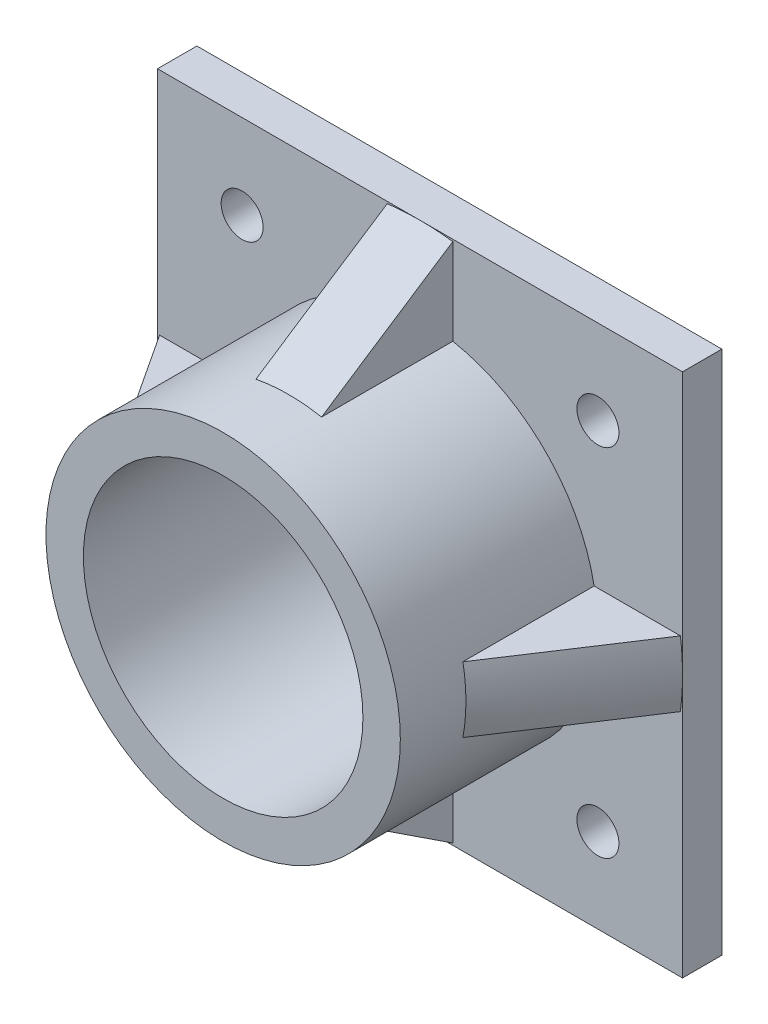
ISO-10303-21;
HEADER;
FILE_DESCRIPTION(('STEP AP214'),'2;1');
FILE_NAME('part.step','',(''),(''),'','','');
FILE_SCHEMA(('AUTOMOTIVE_DESIGN { 1 0 10303 214 1 1 1 1 }'));
ENDSEC;
DATA;
#1=APPLICATION_CONTEXT('core data for automotive mechanical design processes');
#2=APPLICATION_PROTOCOL_DEFINITION('international standard','automotive_design',2000,#1);
#3=PRODUCT_CONTEXT('',#1,'mechanical');
#4=PRODUCT('Part','Part','',(#3));
#5=PRODUCT_RELATED_PRODUCT_CATEGORY('part','',(#4));
#6=PRODUCT_DEFINITION_FORMATION('','',#4);
#7=PRODUCT_DEFINITION_CONTEXT('part definition',#1,'design');
#8=PRODUCT_DEFINITION('design','',#6,#7);
#9=PRODUCT_DEFINITION_SHAPE('','',#8);
#10=(LENGTH_UNIT() NAMED_UNIT(*) SI_UNIT(.MILLI.,.METRE.));
#11=(NAMED_UNIT(*) PLANE_ANGLE_UNIT() SI_UNIT($,.RADIAN.));
#12=(NAMED_UNIT(*) SI_UNIT($,.STERADIAN.) SOLID_ANGLE_UNIT());
#13=UNCERTAINTY_MEASURE_WITH_UNIT(LENGTH_MEASURE(1.E-05),#10,'distance_accuracy_value','');
#14=(GEOMETRIC_REPRESENTATION_CONTEXT(3) GLOBAL_UNCERTAINTY_ASSIGNED_CONTEXT((#13)) GLOBAL_UNIT_ASSIGNED_CONTEXT((#10,
#11,#12)) REPRESENTATION_CONTEXT('',''));
#15=CARTESIAN_POINT('',(0.,0.,0.));
#16=DIRECTION('',(0.,0.,1.));
#17=DIRECTION('',(1.,0.,0.));
#18=AXIS2_PLACEMENT_3D('',#15,#16,#17);
#19=CARTESIAN_POINT('',(0.,2.5,3.));
#20=DIRECTION('',(0.,1.,0.));
#21=DIRECTION('',(0.,0.,1.));
#22=AXIS2_PLACEMENT_3D('',#19,#20,#21);
#23=PLANE('',#22);
#24=CARTESIAN_POINT('',(-13.2664991614826,2.5,13.000000000035));
#25=CARTESIAN_POINT('',(-13.8167145717682,2.5,12.1680904046967));
#26=CARTESIAN_POINT('',(-14.3661758195442,2.5,11.3356828105302));
#27=CARTESIAN_POINT('',(-15.4639292612333,2.5,9.6700983724496));
#28=CARTESIAN_POINT('',(-16.0122214564813,2.5,8.8369215294154));
#29=CARTESIAN_POINT('',(-17.1079769929933,2.5,7.17002393695385));
#30=CARTESIAN_POINT('',(-17.6554403347516,2.5,6.33630318785122));
#31=CARTESIAN_POINT('',(-18.7497238897593,2.5,4.66843835704486));
#32=CARTESIAN_POINT('',(-19.2965441022839,2.5,3.83429427486561));
#33=CARTESIAN_POINT('',(-19.8431348330469,2.5,3.00000000004546));
#34=B_SPLINE_CURVE_WITH_KNOTS('',3,(#24,#25,#26,#27,#28,#29,#30,#31,#32,#33),.UNSPECIFIED.,.F.,
.F.,(4,2,2,2,4),(0.,2.99220437982002,5.98440534148944,8.97660451834087,11.9688070636137),.UNSPECIFIED.);
#35=CARTESIAN_POINT('',(-13.266499161455,2.5,13.0000000000804));
#36=VERTEX_POINT('',#35);
#37=CARTESIAN_POINT('',(-19.8431348330478,2.5,3.0000000000441));
#38=VERTEX_POINT('',#37);
#39=EDGE_CURVE('E491',#36,#38,#34,.T.);
#40=ORIENTED_EDGE('',*,*,#39,.F.);
#41=DIRECTION('',(0.,0.,1.));
#42=VECTOR('',#41,1.);
#43=CARTESIAN_POINT('',(-13.2664991614216,2.5,3.));
#44=LINE('',#43,#42);
#45=CARTESIAN_POINT('',(-13.2664991614216,2.5,3.));
#46=VERTEX_POINT('',#45);
#47=EDGE_CURVE('E485',#46,#36,#44,.T.);
#48=ORIENTED_EDGE('',*,*,#47,.F.);
#49=DIRECTION('',(1.,0.,0.));
#50=VECTOR('',#49,1.);
#51=CARTESIAN_POINT('',(0.,2.5,3.));
#52=LINE('',#51,#50);
#53=EDGE_CURVE('E177',#38,#46,#52,.T.);
#54=ORIENTED_EDGE('',*,*,#53,.F.);
#55=EDGE_LOOP('',(#40,#48,#54));
#56=FACE_BOUND('',#55,.T.);
#57=ADVANCED_FACE('F17',(#56),#23,.T.);
#58=CARTESIAN_POINT('',(-2.5,0.,3.));
#59=DIRECTION('',(1.,0.,0.));
#60=DIRECTION('',(0.,1.,0.));
#61=AXIS2_PLACEMENT_3D('',#58,#59,#60);
#62=PLANE('',#61);
#63=CARTESIAN_POINT('',(-2.5,19.8431348330457,3.00000000004521));
#64=CARTESIAN_POINT('',(-2.5,19.2965441022827,3.83429427486541));
#65=CARTESIAN_POINT('',(-2.5,18.749723889758,4.6684383570447));
#66=CARTESIAN_POINT('',(-2.5,17.6554403347503,6.33630318785116));
#67=CARTESIAN_POINT('',(-2.5,17.107976992992,7.17002393695383));
#68=CARTESIAN_POINT('',(-2.5,16.0122214564799,8.83692152941547));
#69=CARTESIAN_POINT('',(-2.5,15.4639292612319,9.67009837244972));
#70=CARTESIAN_POINT('',(-2.5,14.3661758195427,11.3356828105304));
#71=CARTESIAN_POINT('',(-2.5,13.8167145717667,12.168090404697));
#72=CARTESIAN_POINT('',(-2.5,13.2664991614811,13.0000000000353));
#73=B_SPLINE_CURVE_WITH_KNOTS('',3,(#63,#64,#65,#66,#67,#68,#69,#70,#71,#72),.UNSPECIFIED.,.F.,
.F.,(4,2,2,2,4),(0.,2.99220254527295,5.98440172212455,8.97660268379414,11.9688070636143),.UNSPECIFIED.);
#74=CARTESIAN_POINT('',(-2.5,19.8431348330606,3.0000000000226));
#75=VERTEX_POINT('',#74);
#76=CARTESIAN_POINT('',(-2.5,13.2664991614513,13.0000000000345));
#77=VERTEX_POINT('',#76);
#78=EDGE_CURVE('E21',#75,#77,#73,.T.);
#79=ORIENTED_EDGE('',*,*,#78,.F.);
#80=DIRECTION('',(0.,1.,0.));
#81=VECTOR('',#80,1.);
#82=CARTESIAN_POINT('',(-2.5,0.,3.));
#83=LINE('',#82,#81);
#84=CARTESIAN_POINT('',(-2.5,13.2664991614216,3.));
#85=VERTEX_POINT('',#84);
#86=EDGE_CURVE('E144',#85,#75,#83,.T.);
#87=ORIENTED_EDGE('',*,*,#86,.F.);
#88=DIRECTION('',(0.,0.,1.));
#89=VECTOR('',#88,1.);
#90=CARTESIAN_POINT('',(-2.5,13.2664991614216,3.));
#91=LINE('',#90,#89);
#92=EDGE_CURVE('E158',#77,#85,#91,.F.);
#93=ORIENTED_EDGE('',*,*,#92,.F.);
#94=EDGE_LOOP('',(#79,#87,#93));
#95=FACE_BOUND('',#94,.T.);
#96=ADVANCED_FACE('F157',(#95),#62,.F.);
#97=CARTESIAN_POINT('',(2.5,0.,3.));
#98=DIRECTION('',(1.,0.,0.));
#99=DIRECTION('',(0.,1.,0.));
#100=AXIS2_PLACEMENT_3D('',#97,#98,#99);
#101=PLANE('',#100);
#102=CARTESIAN_POINT('',(2.5,13.2664991614817,13.0000000000343));
#103=CARTESIAN_POINT('',(2.5,13.8167145717672,12.1680904046962));
#104=CARTESIAN_POINT('',(2.5,14.3661758195432,11.3356828105296));
#105=CARTESIAN_POINT('',(2.5,15.4639292612323,9.67009837244911));
#106=CARTESIAN_POINT('',(2.5,16.0122214564802,8.83692152941494));
#107=CARTESIAN_POINT('',(2.5,17.1079769929922,7.17002393695345));
#108=CARTESIAN_POINT('',(2.5,17.6554403347505,6.33630318785085));
#109=CARTESIAN_POINT('',(2.5,18.7497238897581,4.66843835704454));
#110=CARTESIAN_POINT('',(2.5,19.2965441022828,3.83429427486533));
#111=CARTESIAN_POINT('',(2.5,19.8431348330457,3.00000000004521));
#112=B_SPLINE_CURVE_WITH_KNOTS('',3,(#102,#103,#104,#105,#106,#107,#108,#109,#110,#111),
.UNSPECIFIED.,.F.,.F.,(4,2,2,2,4),(0.,2.99220437981991,5.98440534148923,8.97660451834055,
11.9688070636132),.UNSPECIFIED.);
#113=CARTESIAN_POINT('',(2.5,13.2664991614543,13.0000000000794));
#114=VERTEX_POINT('',#113);
#115=CARTESIAN_POINT('',(2.5,19.8431348330466,3.00000000004398));
#116=VERTEX_POINT('',#115);
#117=EDGE_CURVE('E231',#114,#116,#112,.T.);
#118=ORIENTED_EDGE('',*,*,#117,.F.);
#119=DIRECTION('',(0.,0.,1.));
#120=VECTOR('',#119,1.);
#121=CARTESIAN_POINT('',(2.5,13.2664991614216,3.));
#122=LINE('',#121,#120);
#123=CARTESIAN_POINT('',(2.5,13.2664991614216,3.));
#124=VERTEX_POINT('',#123);
#125=EDGE_CURVE('E483',#124,#114,#122,.T.);
#126=ORIENTED_EDGE('',*,*,#125,.F.);
#127=DIRECTION('',(0.,1.,0.));
#128=VECTOR('',#127,1.);
#129=CARTESIAN_POINT('',(2.5,0.,3.));
#130=LINE('',#129,#128);
#131=EDGE_CURVE('E169',#116,#124,#130,.F.);
#132=ORIENTED_EDGE('',*,*,#131,.F.);
#133=EDGE_LOOP('',(#118,#126,#132));
#134=FACE_BOUND('',#133,.T.);
#135=ADVANCED_FACE('F239',(#134),#101,.T.);
#136=CARTESIAN_POINT('',(0.,2.5,3.));
#137=DIRECTION('',(0.,-1.,0.));
#138=DIRECTION('',(1.,0.,0.));
#139=AXIS2_PLACEMENT_3D('',#136,#137,#138);
#140=PLANE('',#139);
#141=CARTESIAN_POINT('',(19.8431348330479,2.5,3.00000000004595));
#142=CARTESIAN_POINT('',(19.2965441022848,2.5,3.83429427486609));
#143=CARTESIAN_POINT('',(18.7497238897601,2.5,4.66843835704532));
#144=CARTESIAN_POINT('',(17.6554403347522,2.5,6.33630318785166));
#145=CARTESIAN_POINT('',(17.1079769929938,2.5,7.17002393695427));
#146=CARTESIAN_POINT('',(16.0122214564816,2.5,8.8369215294158));
#147=CARTESIAN_POINT('',(15.4639292612335,2.5,9.67009837244998));
#148=CARTESIAN_POINT('',(14.3661758195441,2.5,11.3356828105305));
#149=CARTESIAN_POINT('',(13.8167145717681,2.5,12.1680904046971));
#150=CARTESIAN_POINT('',(13.2664991614824,2.5,13.0000000000353));
#151=B_SPLINE_CURVE_WITH_KNOTS('',3,(#141,#142,#143,#144,#145,#146,#147,#148,#149,#150),
.UNSPECIFIED.,.F.,.F.,(4,2,2,2,4),(0.,2.99220254527292,5.98440172212448,8.97660268379404,
11.9688070636142),.UNSPECIFIED.);
#152=CARTESIAN_POINT('',(19.843134833063,2.5,3.00000000002297));
#153=VERTEX_POINT('',#152);
#154=CARTESIAN_POINT('',(13.266499161452,2.5,13.0000000000812));
#155=VERTEX_POINT('',#154);
#156=EDGE_CURVE('E225',#153,#155,#151,.T.);
#157=ORIENTED_EDGE('',*,*,#156,.F.);
#158=DIRECTION('',(1.,0.,0.));
#159=VECTOR('',#158,1.);
#160=CARTESIAN_POINT('',(0.,2.5,3.));
#161=LINE('',#160,#159);
#162=CARTESIAN_POINT('',(13.2664991614216,2.5,3.));
#163=VERTEX_POINT('',#162);
#164=EDGE_CURVE('E404',#163,#153,#161,.T.);
#165=ORIENTED_EDGE('',*,*,#164,.F.);
#166=DIRECTION('',(0.,0.,1.));
#167=VECTOR('',#166,1.);
#168=CARTESIAN_POINT('',(13.2664991614216,2.5,3.));
#169=LINE('',#168,#167);
#170=EDGE_CURVE('E163',#155,#163,#169,.F.);
#171=ORIENTED_EDGE('',*,*,#170,.F.);
#172=EDGE_LOOP('',(#157,#165,#171));
#173=FACE_BOUND('',#172,.T.);
#174=ADVANCED_FACE('F236',(#173),#140,.F.);
#175=CARTESIAN_POINT('',(0.,0.,3.00000000027012));
#176=DIRECTION('',(0.,0.,-1.));
#177=DIRECTION('',(-1.,0.,0.));
#178=AXIS2_PLACEMENT_3D('',#175,#176,#177);
#179=CONICAL_SURFACE('',#178,19.9999999999146,0.576375220591807);
#180=ORIENTED_EDGE('',*,*,#117,.T.);
#181=CARTESIAN_POINT('',(0.,0.,3.00000000004275));
#182=DIRECTION('',(0.,0.,-1.));
#183=DIRECTION('',(-1.,0.,0.));
#184=AXIS2_PLACEMENT_3D('',#181,#182,#183);
#185=CIRCLE('',#184,20.0000000000624);
#186=CARTESIAN_POINT('',(0.,20.0000000000312,3.00000000002137));
#187=VERTEX_POINT('',#186);
#188=EDGE_CURVE('E167',#187,#116,#185,.T.);
#189=ORIENTED_EDGE('',*,*,#188,.F.);
#190=CARTESIAN_POINT('',(0.,0.,3.00000000004275));
#191=DIRECTION('',(0.,0.,-1.));
#192=DIRECTION('',(-1.,0.,0.));
#193=AXIS2_PLACEMENT_3D('',#190,#191,#192);
#194=CIRCLE('',#193,20.0000000000624);
#195=EDGE_CURVE('E149',#75,#187,#194,.T.);
#196=ORIENTED_EDGE('',*,*,#195,.F.);
#197=ORIENTED_EDGE('',*,*,#78,.T.);
#198=CARTESIAN_POINT('',(0.,0.,13.0000000000337));
#199=DIRECTION('',(0.,0.,-1.));
#200=DIRECTION('',(0.185185185183608,0.982703641587082,0.));
#201=AXIS2_PLACEMENT_3D('',#198,#199,#200);
#202=CIRCLE('',#201,13.5000000000643);
#203=EDGE_CURVE('E162',#77,#114,#202,.T.);
#204=ORIENTED_EDGE('',*,*,#203,.T.);
#205=EDGE_LOOP('',(#180,#189,#196,#197,#204));
#206=FACE_BOUND('',#205,.T.);
#207=ADVANCED_FACE('F165',(#206),#179,.T.);
#208=CARTESIAN_POINT('',(0.,-2.5,3.));
#209=DIRECTION('',(0.,-1.,0.));
#210=DIRECTION('',(1.,0.,0.));
#211=AXIS2_PLACEMENT_3D('',#208,#209,#210);
#212=PLANE('',#211);
#213=CARTESIAN_POINT('',(13.2664991614814,-2.5,13.0000000000367));
#214=CARTESIAN_POINT('',(13.8167145717672,-2.5,12.1680904046984));
#215=CARTESIAN_POINT('',(14.3661758195433,-2.5,11.3356828105318));
#216=CARTESIAN_POINT('',(15.4639292612329,-2.5,9.67009837245096));
#217=CARTESIAN_POINT('',(16.012221456481,-2.5,8.83692152941666));
#218=CARTESIAN_POINT('',(17.1079769929934,-2.5,7.17002393695488));
#219=CARTESIAN_POINT('',(17.6554403347519,-2.5,6.33630318785215));
#220=CARTESIAN_POINT('',(18.7497238897599,-2.5,4.66843835704557));
#221=CARTESIAN_POINT('',(19.2965441022848,-2.5,3.83429427486621));
#222=CARTESIAN_POINT('',(19.8431348330479,-2.5,3.00000000004595));
#223=B_SPLINE_CURVE_WITH_KNOTS('',3,(#213,#214,#215,#216,#217,#218,#219,#220,#221,#222),
.UNSPECIFIED.,.F.,.F.,(4,2,2,2,4),(0.,2.99220437982059,5.98440534149059,8.9766045183426,
11.968807063616),.UNSPECIFIED.);
#224=CARTESIAN_POINT('',(13.2664991614216,-2.5,13.0000000000636));
#225=VERTEX_POINT('',#224);
#226=CARTESIAN_POINT('',(19.843134833049,-2.5,3.00000000004435));
#227=VERTEX_POINT('',#226);
#228=EDGE_CURVE('E219',#225,#227,#223,.T.);
#229=ORIENTED_EDGE('',*,*,#228,.F.);
#230=DIRECTION('',(0.,0.,1.));
#231=VECTOR('',#230,1.);
#232=CARTESIAN_POINT('',(13.2664991614216,-2.5,3.));
#233=LINE('',#232,#231);
#234=CARTESIAN_POINT('',(13.2664991614216,-2.5,3.));
#235=VERTEX_POINT('',#234);
#236=EDGE_CURVE('E329',#235,#225,#233,.T.);
#237=ORIENTED_EDGE('',*,*,#236,.F.);
#238=DIRECTION('',(1.,0.,0.));
#239=VECTOR('',#238,1.);
#240=CARTESIAN_POINT('',(0.,-2.5,3.));
#241=LINE('',#240,#239);
#242=EDGE_CURVE('E342',#227,#235,#241,.F.);
#243=ORIENTED_EDGE('',*,*,#242,.F.);
#244=EDGE_LOOP('',(#229,#237,#243));
#245=FACE_BOUND('',#244,.T.);
#246=ADVANCED_FACE('F341',(#245),#212,.T.);
#247=CARTESIAN_POINT('',(2.5,0.,3.));
#248=DIRECTION('',(-1.,0.,0.));
#249=DIRECTION('',(0.,-1.,0.));
#250=AXIS2_PLACEMENT_3D('',#247,#248,#249);
#251=PLANE('',#250);
#252=CARTESIAN_POINT('',(2.5,-19.8431348330468,3.00000000004558));
#253=CARTESIAN_POINT('',(2.5,-19.2965441022838,3.83429427486578));
#254=CARTESIAN_POINT('',(2.5,-18.7497238897591,4.66843835704506));
#255=CARTESIAN_POINT('',(2.5,-17.6554403347514,6.33630318785152));
#256=CARTESIAN_POINT('',(2.5,-17.1079769929931,7.17002393695418));
#257=CARTESIAN_POINT('',(2.5,-16.012221456481,8.83692152941582));
#258=CARTESIAN_POINT('',(2.5,-15.463929261233,9.67009837245006));
#259=CARTESIAN_POINT('',(2.5,-14.3661758195438,11.3356828105307));
#260=CARTESIAN_POINT('',(2.5,-13.8167145717678,12.1680904046973));
#261=CARTESIAN_POINT('',(2.5,-13.2664991614822,13.0000000000356));
#262=B_SPLINE_CURVE_WITH_KNOTS('',3,(#252,#253,#254,#255,#256,#257,#258,#259,#260,#261),
.UNSPECIFIED.,.F.,.F.,(4,2,2,2,4),(0.,2.99220254527293,5.98440172212451,8.97660268379408,
11.9688070636143),.UNSPECIFIED.);
#263=CARTESIAN_POINT('',(2.5,-19.8431348330618,3.00000000002279));
#264=VERTEX_POINT('',#263);
#265=CARTESIAN_POINT('',(2.5,-13.2664991614519,13.0000000000346));
#266=VERTEX_POINT('',#265);
#267=EDGE_CURVE('E192',#264,#266,#262,.T.);
#268=ORIENTED_EDGE('',*,*,#267,.F.);
#269=DIRECTION('',(0.,1.,0.));
#270=VECTOR('',#269,1.);
#271=CARTESIAN_POINT('',(2.5,0.,3.));
#272=LINE('',#271,#270);
#273=CARTESIAN_POINT('',(2.5,-13.2664991614216,3.));
#274=VERTEX_POINT('',#273);
#275=EDGE_CURVE('E401',#274,#264,#272,.F.);
#276=ORIENTED_EDGE('',*,*,#275,.F.);
#277=DIRECTION('',(0.,0.,1.));
#278=VECTOR('',#277,1.);
#279=CARTESIAN_POINT('',(2.5,-13.2664991614216,3.));
#280=LINE('',#279,#278);
#281=EDGE_CURVE('E339',#266,#274,#280,.F.);
#282=ORIENTED_EDGE('',*,*,#281,.F.);
#283=EDGE_LOOP('',(#268,#276,#282));
#284=FACE_BOUND('',#283,.T.);
#285=ADVANCED_FACE('F213',(#284),#251,.F.);
#286=CARTESIAN_POINT('',(0.,0.,3.00000000027012));
#287=DIRECTION('',(0.,0.,-1.));
#288=DIRECTION('',(-1.,0.,0.));
#289=AXIS2_PLACEMENT_3D('',#286,#287,#288);
#290=CONICAL_SURFACE('',#289,19.9999999999173,0.576375220591899);
#291=ORIENTED_EDGE('',*,*,#228,.T.);
#292=CARTESIAN_POINT('',(0.,0.,3.00000000004275));
#293=DIRECTION('',(0.,0.,-1.));
#294=DIRECTION('',(-1.,0.,0.));
#295=AXIS2_PLACEMENT_3D('',#292,#293,#294);
#296=CIRCLE('',#295,20.0000000000651);
#297=CARTESIAN_POINT('',(20.0000000000325,0.,3.00000000002137));
#298=VERTEX_POINT('',#297);
#299=EDGE_CURVE('E397',#298,#227,#296,.T.);
#300=ORIENTED_EDGE('',*,*,#299,.F.);
#301=CARTESIAN_POINT('',(0.,0.,3.00000000004275));
#302=DIRECTION('',(0.,0.,-1.));
#303=DIRECTION('',(-1.,0.,0.));
#304=AXIS2_PLACEMENT_3D('',#301,#302,#303);
#305=CIRCLE('',#304,20.0000000000651);
#306=EDGE_CURVE('E403',#153,#298,#305,.T.);
#307=ORIENTED_EDGE('',*,*,#306,.F.);
#308=ORIENTED_EDGE('',*,*,#156,.T.);
#309=CARTESIAN_POINT('',(0.,0.,13.));
#310=DIRECTION('',(0.,0.,1.));
#311=DIRECTION('',(1.,0.,0.));
#312=AXIS2_PLACEMENT_3D('',#309,#310,#311);
#313=CIRCLE('',#312,13.5);
#314=EDGE_CURVE('E333',#225,#155,#313,.T.);
#315=ORIENTED_EDGE('',*,*,#314,.F.);
#316=EDGE_LOOP('',(#291,#300,#307,#308,#315));
#317=FACE_BOUND('',#316,.T.);
#318=ADVANCED_FACE('F208',(#317),#290,.T.);
#319=CARTESIAN_POINT('',(-2.5,0.,3.));
#320=DIRECTION('',(-1.,0.,0.));
#321=DIRECTION('',(0.,-1.,0.));
#322=AXIS2_PLACEMENT_3D('',#319,#320,#321);
#323=PLANE('',#322);
#324=CARTESIAN_POINT('',(-2.5,-13.2664991614826,13.000000000035));
#325=CARTESIAN_POINT('',(-2.5,-13.8167145717682,12.1680904046968));
#326=CARTESIAN_POINT('',(-2.5,-14.3661758195441,11.3356828105302));
#327=CARTESIAN_POINT('',(-2.5,-15.4639292612333,9.67009837244964));
#328=CARTESIAN_POINT('',(-2.5,-16.0122214564812,8.83692152941545));
#329=CARTESIAN_POINT('',(-2.5,-17.1079769929933,7.17002393695392));
#330=CARTESIAN_POINT('',(-2.5,-17.6554403347515,6.3363031878513));
#331=CARTESIAN_POINT('',(-2.5,-18.7497238897592,4.66843835704495));
#332=CARTESIAN_POINT('',(-2.5,-19.2965441022839,3.83429427486572));
#333=CARTESIAN_POINT('',(-2.5,-19.8431348330468,3.00000000004558));
#334=B_SPLINE_CURVE_WITH_KNOTS('',3,(#324,#325,#326,#327,#328,#329,#330,#331,#332,#333),
.UNSPECIFIED.,.F.,.F.,(4,2,2,2,4),(0.,2.99220437981998,5.98440534148938,8.97660451834076,
11.9688070636135),.UNSPECIFIED.);
#335=CARTESIAN_POINT('',(-2.5,-13.266499161455,13.0000000000804));
#336=VERTEX_POINT('',#335);
#337=CARTESIAN_POINT('',(-2.5,-19.8431348330478,3.00000000004416));
#338=VERTEX_POINT('',#337);
#339=EDGE_CURVE('E184',#336,#338,#334,.T.);
#340=ORIENTED_EDGE('',*,*,#339,.F.);
#341=DIRECTION('',(0.,0.,1.));
#342=VECTOR('',#341,1.);
#343=CARTESIAN_POINT('',(-2.5,-13.2664991614216,3.));
#344=LINE('',#343,#342);
#345=CARTESIAN_POINT('',(-2.5,-13.2664991614216,3.));
#346=VERTEX_POINT('',#345);
#347=EDGE_CURVE('E345',#346,#336,#344,.T.);
#348=ORIENTED_EDGE('',*,*,#347,.F.);
#349=DIRECTION('',(0.,1.,0.));
#350=VECTOR('',#349,1.);
#351=CARTESIAN_POINT('',(-2.5,0.,3.));
#352=LINE('',#351,#350);
#353=EDGE_CURVE('E396',#338,#346,#352,.T.);
#354=ORIENTED_EDGE('',*,*,#353,.F.);
#355=EDGE_LOOP('',(#340,#348,#354));
#356=FACE_BOUND('',#355,.T.);
#357=ADVANCED_FACE('F202',(#356),#323,.T.);
#358=CARTESIAN_POINT('',(0.,0.,3.));
#359=DIRECTION('',(0.,0.,1.));
#360=DIRECTION('',(1.,0.,0.));
#361=AXIS2_PLACEMENT_3D('',#358,#359,#360);
#362=CYLINDRICAL_SURFACE('',#361,13.5);
#363=CARTESIAN_POINT('',(0.,0.,18.));
#364=DIRECTION('',(0.,0.,1.));
#365=DIRECTION('',(1.,0.,0.));
#366=AXIS2_PLACEMENT_3D('',#363,#364,#365);
#367=CIRCLE('',#366,13.5);
#368=CARTESIAN_POINT('',(13.5,0.,18.));
#369=VERTEX_POINT('',#368);
#370=EDGE_CURVE('E181',#369,#369,#367,.T.);
#371=ORIENTED_EDGE('',*,*,#370,.F.);
#372=EDGE_LOOP('',(#371));
#373=FACE_BOUND('',#372,.T.);
#374=ORIENTED_EDGE('',*,*,#236,.T.);
#375=ORIENTED_EDGE('',*,*,#314,.T.);
#376=ORIENTED_EDGE('',*,*,#170,.T.);
#377=CARTESIAN_POINT('',(0.,0.,3.));
#378=DIRECTION('',(0.,0.,1.));
#379=DIRECTION('',(1.,0.,0.));
#380=AXIS2_PLACEMENT_3D('',#377,#378,#379);
#381=CIRCLE('',#380,13.5);
#382=EDGE_CURVE('E171',#124,#163,#381,.F.);
#383=ORIENTED_EDGE('',*,*,#382,.F.);
#384=ORIENTED_EDGE('',*,*,#125,.T.);
#385=ORIENTED_EDGE('',*,*,#203,.F.);
#386=ORIENTED_EDGE('',*,*,#92,.T.);
#387=CARTESIAN_POINT('',(0.,0.,3.));
#388=DIRECTION('',(0.,0.,1.));
#389=DIRECTION('',(1.,0.,0.));
#390=AXIS2_PLACEMENT_3D('',#387,#388,#389);
#391=CIRCLE('',#390,13.5);
#392=EDGE_CURVE('E152',#46,#85,#391,.F.);
#393=ORIENTED_EDGE('',*,*,#392,.F.);
#394=ORIENTED_EDGE('',*,*,#47,.T.);
#395=CARTESIAN_POINT('',(0.,0.,13.0000000000337));
#396=DIRECTION('',(0.,0.,-1.));
#397=DIRECTION('',(-0.982703641586987,0.185185185184117,0.));
#398=AXIS2_PLACEMENT_3D('',#395,#396,#397);
#399=CIRCLE('',#398,13.5000000000656);
#400=CARTESIAN_POINT('',(-13.2664991614519,-2.5,13.0000000000814));
#401=VERTEX_POINT('',#400);
#402=EDGE_CURVE('E489',#401,#36,#399,.T.);
#403=ORIENTED_EDGE('',*,*,#402,.F.);
#404=DIRECTION('',(0.,0.,1.));
#405=VECTOR('',#404,1.);
#406=CARTESIAN_POINT('',(-13.2664991614216,-2.5,3.));
#407=LINE('',#406,#405);
#408=CARTESIAN_POINT('',(-13.2664991614216,-2.5,3.));
#409=VERTEX_POINT('',#408);
#410=EDGE_CURVE('E348',#401,#409,#407,.F.);
#411=ORIENTED_EDGE('',*,*,#410,.T.);
#412=CARTESIAN_POINT('',(0.,0.,3.));
#413=DIRECTION('',(0.,0.,1.));
#414=DIRECTION('',(1.,0.,0.));
#415=AXIS2_PLACEMENT_3D('',#412,#413,#414);
#416=CIRCLE('',#415,13.5);
#417=EDGE_CURVE('E394',#346,#409,#416,.F.);
#418=ORIENTED_EDGE('',*,*,#417,.F.);
#419=ORIENTED_EDGE('',*,*,#347,.T.);
#420=CARTESIAN_POINT('',(0.,0.,13.0000000000337));
#421=DIRECTION('',(0.,0.,-1.));
#422=DIRECTION('',(-0.185185185184117,-0.982703641586987,0.));
#423=AXIS2_PLACEMENT_3D('',#420,#421,#422);
#424=CIRCLE('',#423,13.5000000000656);
#425=EDGE_CURVE('E191',#266,#336,#424,.T.);
#426=ORIENTED_EDGE('',*,*,#425,.F.);
#427=ORIENTED_EDGE('',*,*,#281,.T.);
#428=CARTESIAN_POINT('',(0.,0.,3.));
#429=DIRECTION('',(0.,0.,1.));
#430=DIRECTION('',(1.,0.,0.));
#431=AXIS2_PLACEMENT_3D('',#428,#429,#430);
#432=CIRCLE('',#431,13.5);
#433=EDGE_CURVE('E336',#235,#274,#432,.F.);
#434=ORIENTED_EDGE('',*,*,#433,.F.);
#435=EDGE_LOOP('',(#374,#375,#376,#383,#384,#385,#386,#393,#394,#403,#411,#418,#419,#426,#427,#434));
#436=FACE_BOUND('',#435,.T.);
#437=ADVANCED_FACE('F207',(#373,#436),#362,.T.);
#438=CARTESIAN_POINT('',(0.,-2.5,3.));
#439=DIRECTION('',(0.,1.,0.));
#440=DIRECTION('',(-1.,0.,0.));
#441=AXIS2_PLACEMENT_3D('',#438,#439,#440);
#442=PLANE('',#441);
#443=CARTESIAN_POINT('',(-19.8431348330469,-2.5,3.00000000004546));
#444=CARTESIAN_POINT('',(-19.2965441022839,-2.5,3.83429427486566));
#445=CARTESIAN_POINT('',(-18.7497238897592,-2.5,4.66843835704496));
#446=CARTESIAN_POINT('',(-17.6554403347515,-2.5,6.33630318785143));
#447=CARTESIAN_POINT('',(-17.1079769929931,-2.5,7.17002393695411));
#448=CARTESIAN_POINT('',(-16.012221456481,-2.5,8.83692152941577));
#449=CARTESIAN_POINT('',(-15.463929261233,-2.5,9.67009837245002));
#450=CARTESIAN_POINT('',(-14.3661758195438,-2.5,11.3356828105307));
#451=CARTESIAN_POINT('',(-13.8167145717678,-2.5,12.1680904046973));
#452=CARTESIAN_POINT('',(-13.2664991614822,-2.5,13.0000000000356));
#453=B_SPLINE_CURVE_WITH_KNOTS('',3,(#443,#444,#445,#446,#447,#448,#449,#450,#451,#452),
.UNSPECIFIED.,.F.,.F.,(4,2,2,2,4),(0.,2.99220254527297,5.98440172212458,8.9766026837942,
11.9688070636144),.UNSPECIFIED.);
#454=CARTESIAN_POINT('',(-19.8431348330618,-2.5,3.00000000002273));
#455=VERTEX_POINT('',#454);
#456=EDGE_CURVE('E351',#455,#401,#453,.T.);
#457=ORIENTED_EDGE('',*,*,#456,.F.);
#458=DIRECTION('',(1.,0.,0.));
#459=VECTOR('',#458,1.);
#460=CARTESIAN_POINT('',(0.,-2.5,3.));
#461=LINE('',#460,#459);
#462=EDGE_CURVE('E393',#409,#455,#461,.F.);
#463=ORIENTED_EDGE('',*,*,#462,.F.);
#464=ORIENTED_EDGE('',*,*,#410,.F.);
#465=EDGE_LOOP('',(#457,#463,#464));
#466=FACE_BOUND('',#465,.T.);
#467=ADVANCED_FACE('F326',(#466),#442,.F.);
#468=CARTESIAN_POINT('',(0.,0.,3.00000000027012));
#469=DIRECTION('',(0.,0.,-1.));
#470=DIRECTION('',(-1.,0.,0.));
#471=AXIS2_PLACEMENT_3D('',#468,#469,#470);
#472=CONICAL_SURFACE('',#471,19.999999999916,0.576375220591807);
#473=ORIENTED_EDGE('',*,*,#39,.T.);
#474=CARTESIAN_POINT('',(0.,0.,3.00000000004275));
#475=DIRECTION('',(0.,0.,-1.));
#476=DIRECTION('',(-1.,0.,0.));
#477=AXIS2_PLACEMENT_3D('',#474,#475,#476);
#478=CIRCLE('',#477,20.0000000000637);
#479=CARTESIAN_POINT('',(-20.0000000000319,0.,3.00000000002137));
#480=VERTEX_POINT('',#479);
#481=EDGE_CURVE('E178',#480,#38,#478,.T.);
#482=ORIENTED_EDGE('',*,*,#481,.F.);
#483=CARTESIAN_POINT('',(0.,0.,3.00000000004275));
#484=DIRECTION('',(0.,0.,-1.));
#485=DIRECTION('',(-1.,0.,0.));
#486=AXIS2_PLACEMENT_3D('',#483,#484,#485);
#487=CIRCLE('',#486,20.0000000000637);
#488=EDGE_CURVE('E391',#455,#480,#487,.T.);
#489=ORIENTED_EDGE('',*,*,#488,.F.);
#490=ORIENTED_EDGE('',*,*,#456,.T.);
#491=ORIENTED_EDGE('',*,*,#402,.T.);
#492=EDGE_LOOP('',(#473,#482,#489,#490,#491));
#493=FACE_BOUND('',#492,.T.);
#494=ADVANCED_FACE('F316',(#493),#472,.T.);
#495=CARTESIAN_POINT('',(0.,0.,3.00000000027012));
#496=DIRECTION('',(0.,0.,-1.));
#497=DIRECTION('',(-1.,0.,0.));
#498=AXIS2_PLACEMENT_3D('',#495,#496,#497);
#499=CONICAL_SURFACE('',#498,19.999999999916,0.576375220591807);
#500=ORIENTED_EDGE('',*,*,#339,.T.);
#501=CARTESIAN_POINT('',(0.,0.,3.00000000004275));
#502=DIRECTION('',(0.,0.,-1.));
#503=DIRECTION('',(-1.,0.,0.));
#504=AXIS2_PLACEMENT_3D('',#501,#502,#503);
#505=CIRCLE('',#504,20.0000000000637);
#506=CARTESIAN_POINT('',(0.,-20.0000000000319,3.00000000002137));
#507=VERTEX_POINT('',#506);
#508=EDGE_CURVE('E387',#507,#338,#505,.T.);
#509=ORIENTED_EDGE('',*,*,#508,.F.);
#510=CARTESIAN_POINT('',(0.,0.,3.00000000004275));
#511=DIRECTION('',(0.,0.,-1.));
#512=DIRECTION('',(-1.,0.,0.));
#513=AXIS2_PLACEMENT_3D('',#510,#511,#512);
#514=CIRCLE('',#513,20.0000000000637);
#515=EDGE_CURVE('E399',#264,#507,#514,.T.);
#516=ORIENTED_EDGE('',*,*,#515,.F.);
#517=ORIENTED_EDGE('',*,*,#267,.T.);
#518=ORIENTED_EDGE('',*,*,#425,.T.);
#519=EDGE_LOOP('',(#500,#509,#516,#517,#518));
#520=FACE_BOUND('',#519,.T.);
#521=ADVANCED_FACE('F198',(#520),#499,.T.);
#522=CARTESIAN_POINT('',(0.,0.,18.));
#523=DIRECTION('',(0.,0.,1.));
#524=DIRECTION('',(1.,0.,0.));
#525=AXIS2_PLACEMENT_3D('',#522,#523,#524);
#526=PLANE('',#525);
#527=CARTESIAN_POINT('',(0.,0.,18.));
#528=DIRECTION('',(0.,0.,1.));
#529=DIRECTION('',(1.,0.,0.));
#530=AXIS2_PLACEMENT_3D('',#527,#528,#529);
#531=CIRCLE('',#530,10.65);
#532=CARTESIAN_POINT('',(10.65,0.,18.));
#533=VERTEX_POINT('',#532);
#534=EDGE_CURVE('E321',#533,#533,#531,.F.);
#535=ORIENTED_EDGE('',*,*,#534,.T.);
#536=EDGE_LOOP('',(#535));
#537=FACE_BOUND('',#536,.T.);
#538=ORIENTED_EDGE('',*,*,#370,.T.);
#539=EDGE_LOOP('',(#538));
#540=FACE_BOUND('',#539,.T.);
#541=ADVANCED_FACE('F309',(#537,#540),#526,.T.);
#542=CARTESIAN_POINT('',(0.,0.,3.));
#543=DIRECTION('',(0.,0.,1.));
#544=DIRECTION('',(1.,0.,0.));
#545=AXIS2_PLACEMENT_3D('',#542,#543,#544);
#546=PLANE('',#545);
#547=CARTESIAN_POINT('',(-13.555,13.555,3.));
#548=DIRECTION('',(0.,0.,1.));
#549=DIRECTION('',(1.,0.,0.));
#550=AXIS2_PLACEMENT_3D('',#547,#548,#549);
#551=CIRCLE('',#550,1.6);
#552=CARTESIAN_POINT('',(-11.955,13.555,3.));
#553=VERTEX_POINT('',#552);
#554=EDGE_CURVE('E382',#553,#553,#551,.F.);
#555=ORIENTED_EDGE('',*,*,#554,.T.);
#556=EDGE_LOOP('',(#555));
#557=FACE_BOUND('',#556,.T.);
#558=ORIENTED_EDGE('',*,*,#86,.T.);
#559=ORIENTED_EDGE('',*,*,#195,.T.);
#560=DIRECTION('',(1.,0.,0.));
#561=VECTOR('',#560,1.);
#562=CARTESIAN_POINT('',(20.,20.,3.));
#563=LINE('',#562,#561);
#564=CARTESIAN_POINT('',(-20.,20.,3.));
#565=VERTEX_POINT('',#564);
#566=EDGE_CURVE('E413',#565,#187,#563,.T.);
#567=ORIENTED_EDGE('',*,*,#566,.F.);
#568=DIRECTION('',(0.,1.,0.));
#569=VECTOR('',#568,1.);
#570=CARTESIAN_POINT('',(-20.,20.,3.));
#571=LINE('',#570,#569);
#572=EDGE_CURVE('E429',#480,#565,#571,.T.);
#573=ORIENTED_EDGE('',*,*,#572,.F.);
#574=ORIENTED_EDGE('',*,*,#481,.T.);
#575=ORIENTED_EDGE('',*,*,#53,.T.);
#576=ORIENTED_EDGE('',*,*,#392,.T.);
#577=EDGE_LOOP('',(#558,#559,#567,#573,#574,#575,#576));
#578=FACE_BOUND('',#577,.T.);
#579=ADVANCED_FACE('F146',(#557,#578),#546,.T.);
#580=CARTESIAN_POINT('',(0.,0.,3.));
#581=DIRECTION('',(0.,0.,1.));
#582=DIRECTION('',(1.,0.,0.));
#583=AXIS2_PLACEMENT_3D('',#580,#581,#582);
#584=PLANE('',#583);
#585=CARTESIAN_POINT('',(13.555,13.555,3.));
#586=DIRECTION('',(0.,0.,1.));
#587=DIRECTION('',(1.,0.,0.));
#588=AXIS2_PLACEMENT_3D('',#585,#586,#587);
#589=CIRCLE('',#588,1.6);
#590=CARTESIAN_POINT('',(15.155,13.555,3.));
#591=VERTEX_POINT('',#590);
#592=EDGE_CURVE('E379',#591,#591,#589,.F.);
#593=ORIENTED_EDGE('',*,*,#592,.T.);
#594=EDGE_LOOP('',(#593));
#595=FACE_BOUND('',#594,.T.);
#596=DIRECTION('',(1.,0.,0.));
#597=VECTOR('',#596,1.);
#598=CARTESIAN_POINT('',(20.,20.,3.));
#599=LINE('',#598,#597);
#600=CARTESIAN_POINT('',(20.,20.,3.));
#601=VERTEX_POINT('',#600);
#602=EDGE_CURVE('E386',#187,#601,#599,.T.);
#603=ORIENTED_EDGE('',*,*,#602,.F.);
#604=ORIENTED_EDGE('',*,*,#188,.T.);
#605=ORIENTED_EDGE('',*,*,#131,.T.);
#606=ORIENTED_EDGE('',*,*,#382,.T.);
#607=ORIENTED_EDGE('',*,*,#164,.T.);
#608=ORIENTED_EDGE('',*,*,#306,.T.);
#609=DIRECTION('',(0.,1.,0.));
#610=VECTOR('',#609,1.);
#611=CARTESIAN_POINT('',(20.,-20.,3.));
#612=LINE('',#611,#610);
#613=EDGE_CURVE('E443',#601,#298,#612,.F.);
#614=ORIENTED_EDGE('',*,*,#613,.F.);
#615=EDGE_LOOP('',(#603,#604,#605,#606,#607,#608,#614));
#616=FACE_BOUND('',#615,.T.);
#617=ADVANCED_FACE('F303',(#595,#616),#584,.T.);
#618=CARTESIAN_POINT('',(0.,0.,3.));
#619=DIRECTION('',(0.,0.,1.));
#620=DIRECTION('',(1.,0.,0.));
#621=AXIS2_PLACEMENT_3D('',#618,#619,#620);
#622=PLANE('',#621);
#623=CARTESIAN_POINT('',(13.555,-13.555,3.));
#624=DIRECTION('',(0.,0.,1.));
#625=DIRECTION('',(1.,0.,0.));
#626=AXIS2_PLACEMENT_3D('',#623,#624,#625);
#627=CIRCLE('',#626,1.6);
#628=CARTESIAN_POINT('',(15.155,-13.555,3.));
#629=VERTEX_POINT('',#628);
#630=EDGE_CURVE('E376',#629,#629,#627,.F.);
#631=ORIENTED_EDGE('',*,*,#630,.T.);
#632=EDGE_LOOP('',(#631));
#633=FACE_BOUND('',#632,.T.);
#634=DIRECTION('',(0.,1.,0.));
#635=VECTOR('',#634,1.);
#636=CARTESIAN_POINT('',(20.,-20.,3.));
#637=LINE('',#636,#635);
#638=CARTESIAN_POINT('',(20.,-20.,3.));
#639=VERTEX_POINT('',#638);
#640=EDGE_CURVE('E422',#298,#639,#637,.F.);
#641=ORIENTED_EDGE('',*,*,#640,.F.);
#642=ORIENTED_EDGE('',*,*,#299,.T.);
#643=ORIENTED_EDGE('',*,*,#242,.T.);
#644=ORIENTED_EDGE('',*,*,#433,.T.);
#645=ORIENTED_EDGE('',*,*,#275,.T.);
#646=ORIENTED_EDGE('',*,*,#515,.T.);
#647=DIRECTION('',(1.,0.,0.));
#648=VECTOR('',#647,1.);
#649=CARTESIAN_POINT('',(-20.,-20.,3.));
#650=LINE('',#649,#648);
#651=EDGE_CURVE('E460',#639,#507,#650,.F.);
#652=ORIENTED_EDGE('',*,*,#651,.F.);
#653=EDGE_LOOP('',(#641,#642,#643,#644,#645,#646,#652));
#654=FACE_BOUND('',#653,.T.);
#655=ADVANCED_FACE('F299',(#633,#654),#622,.T.);
#656=CARTESIAN_POINT('',(0.,0.,3.));
#657=DIRECTION('',(0.,0.,1.));
#658=DIRECTION('',(1.,0.,0.));
#659=AXIS2_PLACEMENT_3D('',#656,#657,#658);
#660=PLANE('',#659);
#661=CARTESIAN_POINT('',(-13.555,-13.555,3.));
#662=DIRECTION('',(0.,0.,1.));
#663=DIRECTION('',(1.,0.,0.));
#664=AXIS2_PLACEMENT_3D('',#661,#662,#663);
#665=CIRCLE('',#664,1.6);
#666=CARTESIAN_POINT('',(-11.955,-13.555,3.));
#667=VERTEX_POINT('',#666);
#668=EDGE_CURVE('E372',#667,#667,#665,.F.);
#669=ORIENTED_EDGE('',*,*,#668,.T.);
#670=EDGE_LOOP('',(#669));
#671=FACE_BOUND('',#670,.T.);
#672=DIRECTION('',(1.,0.,0.));
#673=VECTOR('',#672,1.);
#674=CARTESIAN_POINT('',(-20.,-20.,3.));
#675=LINE('',#674,#673);
#676=CARTESIAN_POINT('',(-20.,-20.,3.));
#677=VERTEX_POINT('',#676);
#678=EDGE_CURVE('E457',#507,#677,#675,.F.);
#679=ORIENTED_EDGE('',*,*,#678,.F.);
#680=ORIENTED_EDGE('',*,*,#508,.T.);
#681=ORIENTED_EDGE('',*,*,#353,.T.);
#682=ORIENTED_EDGE('',*,*,#417,.T.);
#683=ORIENTED_EDGE('',*,*,#462,.T.);
#684=ORIENTED_EDGE('',*,*,#488,.T.);
#685=DIRECTION('',(0.,1.,0.));
#686=VECTOR('',#685,1.);
#687=CARTESIAN_POINT('',(-20.,20.,3.));
#688=LINE('',#687,#686);
#689=EDGE_CURVE('E390',#677,#480,#688,.T.);
#690=ORIENTED_EDGE('',*,*,#689,.F.);
#691=EDGE_LOOP('',(#679,#680,#681,#682,#683,#684,#690));
#692=FACE_BOUND('',#691,.T.);
#693=ADVANCED_FACE('F295',(#671,#692),#660,.T.);
#694=CARTESIAN_POINT('',(-20.,20.,0.));
#695=DIRECTION('',(-1.,0.,0.));
#696=DIRECTION('',(0.,0.,1.));
#697=AXIS2_PLACEMENT_3D('',#694,#695,#696);
#698=PLANE('',#697);
#699=ORIENTED_EDGE('',*,*,#689,.T.);
#700=ORIENTED_EDGE('',*,*,#572,.T.);
#701=DIRECTION('',(0.,0.,1.));
#702=VECTOR('',#701,1.);
#703=CARTESIAN_POINT('',(-20.,20.,0.));
#704=LINE('',#703,#702);
#705=CARTESIAN_POINT('',(-20.,20.,0.));
#706=VERTEX_POINT('',#705);
#707=EDGE_CURVE('E415',#706,#565,#704,.T.);
#708=ORIENTED_EDGE('',*,*,#707,.F.);
#709=DIRECTION('',(0.,1.,0.));
#710=VECTOR('',#709,1.);
#711=CARTESIAN_POINT('',(-20.,0.,0.));
#712=LINE('',#711,#710);
#713=CARTESIAN_POINT('',(-20.,-20.,0.));
#714=VERTEX_POINT('',#713);
#715=EDGE_CURVE('E375',#706,#714,#712,.F.);
#716=ORIENTED_EDGE('',*,*,#715,.T.);
#717=DIRECTION('',(0.,0.,-1.));
#718=VECTOR('',#717,1.);
#719=CARTESIAN_POINT('',(-20.,-20.,0.));
#720=LINE('',#719,#718);
#721=EDGE_CURVE('E431',#677,#714,#720,.T.);
#722=ORIENTED_EDGE('',*,*,#721,.F.);
#723=EDGE_LOOP('',(#699,#700,#708,#716,#722));
#724=FACE_BOUND('',#723,.T.);
#725=ADVANCED_FACE('F291',(#724),#698,.T.);
#726=CARTESIAN_POINT('',(-20.,-20.,0.));
#727=DIRECTION('',(0.,-1.,0.));
#728=DIRECTION('',(0.,0.,-1.));
#729=AXIS2_PLACEMENT_3D('',#726,#727,#728);
#730=PLANE('',#729);
#731=ORIENTED_EDGE('',*,*,#651,.T.);
#732=ORIENTED_EDGE('',*,*,#678,.T.);
#733=ORIENTED_EDGE('',*,*,#721,.T.);
#734=DIRECTION('',(1.,0.,0.));
#735=VECTOR('',#734,1.);
#736=CARTESIAN_POINT('',(0.,-20.,0.));
#737=LINE('',#736,#735);
#738=CARTESIAN_POINT('',(20.,-20.,0.));
#739=VERTEX_POINT('',#738);
#740=EDGE_CURVE('E436',#714,#739,#737,.T.);
#741=ORIENTED_EDGE('',*,*,#740,.T.);
#742=DIRECTION('',(0.,0.,-1.));
#743=VECTOR('',#742,1.);
#744=CARTESIAN_POINT('',(20.,-20.,0.));
#745=LINE('',#744,#743);
#746=EDGE_CURVE('E445',#639,#739,#745,.T.);
#747=ORIENTED_EDGE('',*,*,#746,.F.);
#748=EDGE_LOOP('',(#731,#732,#733,#741,#747));
#749=FACE_BOUND('',#748,.T.);
#750=ADVANCED_FACE('F287',(#749),#730,.T.);
#751=CARTESIAN_POINT('',(20.,-20.,0.));
#752=DIRECTION('',(1.,0.,0.));
#753=DIRECTION('',(0.,0.,-1.));
#754=AXIS2_PLACEMENT_3D('',#751,#752,#753);
#755=PLANE('',#754);
#756=ORIENTED_EDGE('',*,*,#613,.T.);
#757=ORIENTED_EDGE('',*,*,#640,.T.);
#758=ORIENTED_EDGE('',*,*,#746,.T.);
#759=DIRECTION('',(0.,1.,0.));
#760=VECTOR('',#759,1.);
#761=CARTESIAN_POINT('',(20.,0.,0.));
#762=LINE('',#761,#760);
#763=CARTESIAN_POINT('',(20.,20.,0.));
#764=VERTEX_POINT('',#763);
#765=EDGE_CURVE('E440',#739,#764,#762,.T.);
#766=ORIENTED_EDGE('',*,*,#765,.T.);
#767=DIRECTION('',(0.,0.,1.));
#768=VECTOR('',#767,1.);
#769=CARTESIAN_POINT('',(20.,20.,0.));
#770=LINE('',#769,#768);
#771=EDGE_CURVE('E40',#601,#764,#770,.F.);
#772=ORIENTED_EDGE('',*,*,#771,.F.);
#773=EDGE_LOOP('',(#756,#757,#758,#766,#772));
#774=FACE_BOUND('',#773,.T.);
#775=ADVANCED_FACE('F284',(#774),#755,.T.);
#776=CARTESIAN_POINT('',(20.,20.,0.));
#777=DIRECTION('',(0.,1.,0.));
#778=DIRECTION('',(0.,0.,1.));
#779=AXIS2_PLACEMENT_3D('',#776,#777,#778);
#780=PLANE('',#779);
#781=ORIENTED_EDGE('',*,*,#566,.T.);
#782=ORIENTED_EDGE('',*,*,#602,.T.);
#783=ORIENTED_EDGE('',*,*,#771,.T.);
#784=DIRECTION('',(1.,0.,0.));
#785=VECTOR('',#784,1.);
#786=CARTESIAN_POINT('',(0.,20.,0.));
#787=LINE('',#786,#785);
#788=EDGE_CURVE('E371',#764,#706,#787,.F.);
#789=ORIENTED_EDGE('',*,*,#788,.T.);
#790=ORIENTED_EDGE('',*,*,#707,.T.);
#791=EDGE_LOOP('',(#781,#782,#783,#789,#790));
#792=FACE_BOUND('',#791,.T.);
#793=ADVANCED_FACE('F280',(#792),#780,.T.);
#794=CARTESIAN_POINT('',(0.,0.,0.));
#795=DIRECTION('',(0.,0.,1.));
#796=DIRECTION('',(1.,0.,0.));
#797=AXIS2_PLACEMENT_3D('',#794,#795,#796);
#798=CYLINDRICAL_SURFACE('',#797,10.65);
#799=ORIENTED_EDGE('',*,*,#534,.F.);
#800=EDGE_LOOP('',(#799));
#801=FACE_BOUND('',#800,.T.);
#802=CARTESIAN_POINT('',(0.,0.,0.));
#803=DIRECTION('',(0.,0.,1.));
#804=DIRECTION('',(1.,0.,0.));
#805=AXIS2_PLACEMENT_3D('',#802,#803,#804);
#806=CIRCLE('',#805,10.65);
#807=CARTESIAN_POINT('',(10.65,0.,0.));
#808=VERTEX_POINT('',#807);
#809=EDGE_CURVE('E368',#808,#808,#806,.F.);
#810=ORIENTED_EDGE('',*,*,#809,.T.);
#811=EDGE_LOOP('',(#810));
#812=FACE_BOUND('',#811,.T.);
#813=ADVANCED_FACE('F276',(#801,#812),#798,.F.);
#814=CARTESIAN_POINT('',(-13.555,13.555,0.));
#815=DIRECTION('',(0.,0.,1.));
#816=DIRECTION('',(1.,0.,0.));
#817=AXIS2_PLACEMENT_3D('',#814,#815,#816);
#818=CYLINDRICAL_SURFACE('',#817,1.6);
#819=ORIENTED_EDGE('',*,*,#554,.F.);
#820=EDGE_LOOP('',(#819));
#821=FACE_BOUND('',#820,.T.);
#822=CARTESIAN_POINT('',(-13.555,13.555,0.));
#823=DIRECTION('',(0.,0.,1.));
#824=DIRECTION('',(1.,0.,0.));
#825=AXIS2_PLACEMENT_3D('',#822,#823,#824);
#826=CIRCLE('',#825,1.6);
#827=CARTESIAN_POINT('',(-11.955,13.555,0.));
#828=VERTEX_POINT('',#827);
#829=EDGE_CURVE('E365',#828,#828,#826,.F.);
#830=ORIENTED_EDGE('',*,*,#829,.T.);
#831=EDGE_LOOP('',(#830));
#832=FACE_BOUND('',#831,.T.);
#833=ADVANCED_FACE('F272',(#821,#832),#818,.F.);
#834=CARTESIAN_POINT('',(13.555,13.555,0.));
#835=DIRECTION('',(0.,0.,1.));
#836=DIRECTION('',(1.,0.,0.));
#837=AXIS2_PLACEMENT_3D('',#834,#835,#836);
#838=CYLINDRICAL_SURFACE('',#837,1.6);
#839=ORIENTED_EDGE('',*,*,#592,.F.);
#840=EDGE_LOOP('',(#839));
#841=FACE_BOUND('',#840,.T.);
#842=CARTESIAN_POINT('',(13.555,13.555,0.));
#843=DIRECTION('',(0.,0.,1.));
#844=DIRECTION('',(1.,0.,0.));
#845=AXIS2_PLACEMENT_3D('',#842,#843,#844);
#846=CIRCLE('',#845,1.6);
#847=CARTESIAN_POINT('',(15.155,13.555,0.));
#848=VERTEX_POINT('',#847);
#849=EDGE_CURVE('E362',#848,#848,#846,.F.);
#850=ORIENTED_EDGE('',*,*,#849,.T.);
#851=EDGE_LOOP('',(#850));
#852=FACE_BOUND('',#851,.T.);
#853=ADVANCED_FACE('F268',(#841,#852),#838,.F.);
#854=CARTESIAN_POINT('',(13.555,-13.555,0.));
#855=DIRECTION('',(0.,0.,1.));
#856=DIRECTION('',(1.,0.,0.));
#857=AXIS2_PLACEMENT_3D('',#854,#855,#856);
#858=CYLINDRICAL_SURFACE('',#857,1.6);
#859=ORIENTED_EDGE('',*,*,#630,.F.);
#860=EDGE_LOOP('',(#859));
#861=FACE_BOUND('',#860,.T.);
#862=CARTESIAN_POINT('',(13.555,-13.555,0.));
#863=DIRECTION('',(0.,0.,1.));
#864=DIRECTION('',(1.,0.,0.));
#865=AXIS2_PLACEMENT_3D('',#862,#863,#864);
#866=CIRCLE('',#865,1.6);
#867=CARTESIAN_POINT('',(15.155,-13.555,0.));
#868=VERTEX_POINT('',#867);
#869=EDGE_CURVE('E31',#868,#868,#866,.F.);
#870=ORIENTED_EDGE('',*,*,#869,.T.);
#871=EDGE_LOOP('',(#870));
#872=FACE_BOUND('',#871,.T.);
#873=ADVANCED_FACE('F260',(#861,#872),#858,.F.);
#874=CARTESIAN_POINT('',(-13.555,-13.555,0.));
#875=DIRECTION('',(0.,0.,1.));
#876=DIRECTION('',(1.,0.,0.));
#877=AXIS2_PLACEMENT_3D('',#874,#875,#876);
#878=CYLINDRICAL_SURFACE('',#877,1.6);
#879=ORIENTED_EDGE('',*,*,#668,.F.);
#880=EDGE_LOOP('',(#879));
#881=FACE_BOUND('',#880,.T.);
#882=CARTESIAN_POINT('',(-13.555,-13.555,0.));
#883=DIRECTION('',(0.,0.,1.));
#884=DIRECTION('',(1.,0.,0.));
#885=AXIS2_PLACEMENT_3D('',#882,#883,#884);
#886=CIRCLE('',#885,1.6);
#887=CARTESIAN_POINT('',(-11.955,-13.555,0.));
#888=VERTEX_POINT('',#887);
#889=EDGE_CURVE('E11',#888,#888,#886,.F.);
#890=ORIENTED_EDGE('',*,*,#889,.T.);
#891=EDGE_LOOP('',(#890));
#892=FACE_BOUND('',#891,.T.);
#893=ADVANCED_FACE('F254',(#881,#892),#878,.F.);
#894=CARTESIAN_POINT('',(0.,0.,0.));
#895=DIRECTION('',(0.,0.,1.));
#896=DIRECTION('',(1.,0.,0.));
#897=AXIS2_PLACEMENT_3D('',#894,#895,#896);
#898=PLANE('',#897);
#899=ORIENTED_EDGE('',*,*,#889,.F.);
#900=EDGE_LOOP('',(#899));
#901=FACE_BOUND('',#900,.T.);
#902=ORIENTED_EDGE('',*,*,#869,.F.);
#903=EDGE_LOOP('',(#902));
#904=FACE_BOUND('',#903,.T.);
#905=ORIENTED_EDGE('',*,*,#849,.F.);
#906=EDGE_LOOP('',(#905));
#907=FACE_BOUND('',#906,.T.);
#908=ORIENTED_EDGE('',*,*,#829,.F.);
#909=EDGE_LOOP('',(#908));
#910=FACE_BOUND('',#909,.T.);
#911=ORIENTED_EDGE('',*,*,#809,.F.);
#912=EDGE_LOOP('',(#911));
#913=FACE_BOUND('',#912,.T.);
#914=ORIENTED_EDGE('',*,*,#765,.F.);
#915=ORIENTED_EDGE('',*,*,#740,.F.);
#916=ORIENTED_EDGE('',*,*,#715,.F.);
#917=ORIENTED_EDGE('',*,*,#788,.F.);
#918=EDGE_LOOP('',(#914,#915,#916,#917));
#919=FACE_BOUND('',#918,.T.);
#920=ADVANCED_FACE('F252',(#901,#904,#907,#910,#913,#919),#898,.F.);
#921=CLOSED_SHELL('',(#57,#96,#135,#174,#207,#246,#285,#318,#357,#437,#467,#494,#521,#541,#579,
#617,#655,#693,#725,#750,#775,#793,#813,#833,#853,#873,#893,#920));
#922=MANIFOLD_SOLID_BREP('B1',#921);
#923=ADVANCED_BREP_SHAPE_REPRESENTATION('',(#18,#922),#14);
#924=SHAPE_DEFINITION_REPRESENTATION(#9,#923);
ENDSEC;
END-ISO-10303-21;
